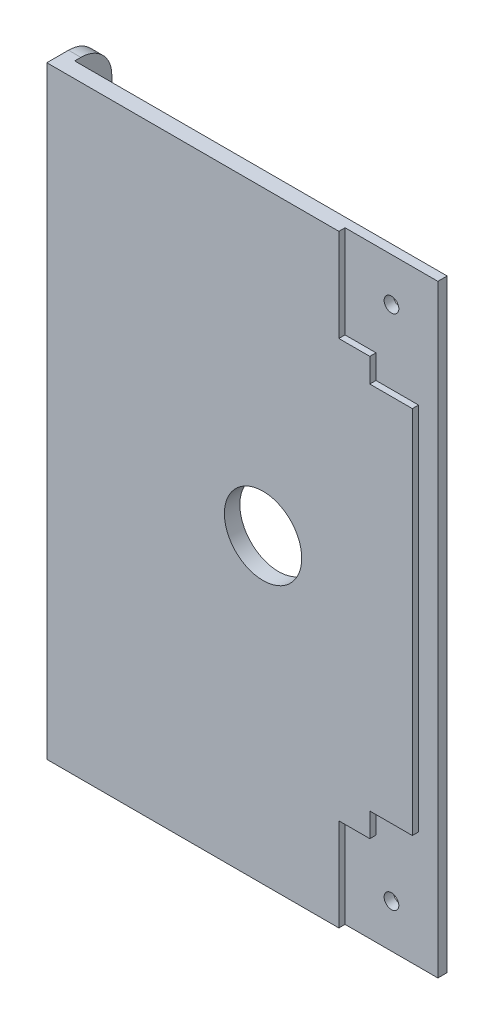
ISO-10303-21;
HEADER;
FILE_DESCRIPTION(('STEP AP214'),'2;1');
FILE_NAME('part.step','',(''),(''),'','','');
FILE_SCHEMA(('AUTOMOTIVE_DESIGN { 1 0 10303 214 1 1 1 1 }'));
ENDSEC;
DATA;
#1=APPLICATION_CONTEXT('core data for automotive mechanical design processes');
#2=APPLICATION_PROTOCOL_DEFINITION('international standard','automotive_design',2000,#1);
#3=PRODUCT_CONTEXT('',#1,'mechanical');
#4=PRODUCT('Part','Part','',(#3));
#5=PRODUCT_RELATED_PRODUCT_CATEGORY('part','',(#4));
#6=PRODUCT_DEFINITION_FORMATION('','',#4);
#7=PRODUCT_DEFINITION_CONTEXT('part definition',#1,'design');
#8=PRODUCT_DEFINITION('design','',#6,#7);
#9=PRODUCT_DEFINITION_SHAPE('','',#8);
#10=(LENGTH_UNIT() NAMED_UNIT(*) SI_UNIT(.MILLI.,.METRE.));
#11=(NAMED_UNIT(*) PLANE_ANGLE_UNIT() SI_UNIT($,.RADIAN.));
#12=(NAMED_UNIT(*) SI_UNIT($,.STERADIAN.) SOLID_ANGLE_UNIT());
#13=UNCERTAINTY_MEASURE_WITH_UNIT(LENGTH_MEASURE(1.E-05),#10,'distance_accuracy_value','');
#14=(GEOMETRIC_REPRESENTATION_CONTEXT(3) GLOBAL_UNCERTAINTY_ASSIGNED_CONTEXT((#13)) GLOBAL_UNIT_ASSIGNED_CONTEXT((#10,
#11,#12)) REPRESENTATION_CONTEXT('',''));
#15=CARTESIAN_POINT('',(0.,0.,0.));
#16=DIRECTION('',(0.,0.,1.));
#17=DIRECTION('',(1.,0.,0.));
#18=AXIS2_PLACEMENT_3D('',#15,#16,#17);
#19=CARTESIAN_POINT('',(-117.291706813187,-97.23732,5.));
#20=DIRECTION('',(0.,1.,0.));
#21=DIRECTION('',(0.,0.,1.));
#22=AXIS2_PLACEMENT_3D('',#19,#20,#21);
#23=PLANE('',#22);
#24=DIRECTION('',(1.,0.,0.));
#25=VECTOR('',#24,1.);
#26=CARTESIAN_POINT('',(-117.291706813187,-97.23732,5.));
#27=LINE('',#26,#25);
#28=CARTESIAN_POINT('',(7.08829318681305,-97.23732,5.));
#29=VERTEX_POINT('',#28);
#30=CARTESIAN_POINT('',(101.468293186813,-97.23732,5.));
#31=VERTEX_POINT('',#30);
#32=EDGE_CURVE('E235',#29,#31,#27,.T.);
#33=ORIENTED_EDGE('',*,*,#32,.F.);
#34=DIRECTION('',(0.,0.,-1.));
#35=VECTOR('',#34,1.);
#36=CARTESIAN_POINT('',(7.08829318681305,-97.23732,5.));
#37=LINE('',#36,#35);
#38=CARTESIAN_POINT('',(7.08829318681305,-97.23732,-2.));
#39=VERTEX_POINT('',#38);
#40=EDGE_CURVE('E210',#29,#39,#37,.T.);
#41=ORIENTED_EDGE('',*,*,#40,.T.);
#42=DIRECTION('',(-1.,0.,0.));
#43=VECTOR('',#42,1.);
#44=CARTESIAN_POINT('',(-117.291706813187,-97.23732,-2.));
#45=LINE('',#44,#43);
#46=CARTESIAN_POINT('',(11.088293186813,-97.23732,-2.));
#47=VERTEX_POINT('',#46);
#48=EDGE_CURVE('E308',#39,#47,#45,.F.);
#49=ORIENTED_EDGE('',*,*,#48,.T.);
#50=DIRECTION('',(0.,0.,-1.));
#51=VECTOR('',#50,1.);
#52=CARTESIAN_POINT('',(11.088293186813,-97.23732,0.));
#53=LINE('',#52,#51);
#54=CARTESIAN_POINT('',(11.088293186813,-97.23732,0.));
#55=VERTEX_POINT('',#54);
#56=EDGE_CURVE('E327',#55,#47,#53,.T.);
#57=ORIENTED_EDGE('',*,*,#56,.F.);
#58=DIRECTION('',(1.,0.,0.));
#59=VECTOR('',#58,1.);
#60=CARTESIAN_POINT('',(-117.291706813187,-97.23732,0.));
#61=LINE('',#60,#59);
#62=CARTESIAN_POINT('',(131.468293186813,-97.23732,0.));
#63=VERTEX_POINT('',#62);
#64=EDGE_CURVE('E245',#55,#63,#61,.T.);
#65=ORIENTED_EDGE('',*,*,#64,.T.);
#66=DIRECTION('',(0.,0.,-1.));
#67=VECTOR('',#66,1.);
#68=CARTESIAN_POINT('',(131.468293186813,-97.23732,5.));
#69=LINE('',#68,#67);
#70=CARTESIAN_POINT('',(131.468293186813,-97.23732,3.));
#71=VERTEX_POINT('',#70);
#72=EDGE_CURVE('E239',#71,#63,#69,.T.);
#73=ORIENTED_EDGE('',*,*,#72,.F.);
#74=DIRECTION('',(1.,0.,0.));
#75=VECTOR('',#74,1.);
#76=CARTESIAN_POINT('',(131.468293186813,-97.23732,3.));
#77=LINE('',#76,#75);
#78=CARTESIAN_POINT('',(101.468293186813,-97.23732,3.));
#79=VERTEX_POINT('',#78);
#80=EDGE_CURVE('E455',#79,#71,#77,.T.);
#81=ORIENTED_EDGE('',*,*,#80,.F.);
#82=DIRECTION('',(0.,0.,1.));
#83=VECTOR('',#82,1.);
#84=CARTESIAN_POINT('',(101.468293186813,-97.23732,3.));
#85=LINE('',#84,#83);
#86=EDGE_CURVE('E456',#79,#31,#85,.T.);
#87=ORIENTED_EDGE('',*,*,#86,.T.);
#88=EDGE_LOOP('',(#33,#41,#49,#57,#65,#73,#81,#87));
#89=FACE_BOUND('',#88,.T.);
#90=ADVANCED_FACE('F45',(#89),#23,.F.);
#91=CARTESIAN_POINT('',(131.468293186813,97.76268,5.));
#92=DIRECTION('',(-1.,0.,0.));
#93=DIRECTION('',(0.,0.,1.));
#94=AXIS2_PLACEMENT_3D('',#91,#92,#93);
#95=PLANE('',#94);
#96=DIRECTION('',(0.,1.,0.));
#97=VECTOR('',#96,1.);
#98=CARTESIAN_POINT('',(131.468293186813,97.76268,3.));
#99=LINE('',#98,#97);
#100=CARTESIAN_POINT('',(131.468293186813,97.76268,3.));
#101=VERTEX_POINT('',#100);
#102=EDGE_CURVE('E486',#71,#101,#99,.T.);
#103=ORIENTED_EDGE('',*,*,#102,.F.);
#104=ORIENTED_EDGE('',*,*,#72,.T.);
#105=DIRECTION('',(0.,1.,0.));
#106=VECTOR('',#105,1.);
#107=CARTESIAN_POINT('',(131.468293186813,97.76268,0.));
#108=LINE('',#107,#106);
#109=CARTESIAN_POINT('',(131.468293186813,97.76268,0.));
#110=VERTEX_POINT('',#109);
#111=EDGE_CURVE('E248',#63,#110,#108,.T.);
#112=ORIENTED_EDGE('',*,*,#111,.T.);
#113=DIRECTION('',(0.,0.,-1.));
#114=VECTOR('',#113,1.);
#115=CARTESIAN_POINT('',(131.468293186813,97.76268,5.));
#116=LINE('',#115,#114);
#117=EDGE_CURVE('E234',#101,#110,#116,.T.);
#118=ORIENTED_EDGE('',*,*,#117,.F.);
#119=EDGE_LOOP('',(#103,#104,#112,#118));
#120=FACE_BOUND('',#119,.T.);
#121=ADVANCED_FACE('F508',(#120),#95,.F.);
#122=CARTESIAN_POINT('',(-117.291706813187,97.76268,5.));
#123=DIRECTION('',(0.,-1.,0.));
#124=DIRECTION('',(0.,0.,-1.));
#125=AXIS2_PLACEMENT_3D('',#122,#123,#124);
#126=PLANE('',#125);
#127=DIRECTION('',(-1.,0.,0.));
#128=VECTOR('',#127,1.);
#129=CARTESIAN_POINT('',(-117.291706813187,97.76268,-2.));
#130=LINE('',#129,#128);
#131=CARTESIAN_POINT('',(11.0882931868131,97.76268,-2.));
#132=VERTEX_POINT('',#131);
#133=CARTESIAN_POINT('',(7.08829318681309,97.76268,-2.));
#134=VERTEX_POINT('',#133);
#135=EDGE_CURVE('E224',#132,#134,#130,.T.);
#136=ORIENTED_EDGE('',*,*,#135,.T.);
#137=DIRECTION('',(0.,0.,-1.));
#138=VECTOR('',#137,1.);
#139=CARTESIAN_POINT('',(7.08829318681309,97.76268,5.));
#140=LINE('',#139,#138);
#141=CARTESIAN_POINT('',(7.08829318681309,97.76268,5.));
#142=VERTEX_POINT('',#141);
#143=EDGE_CURVE('E62',#142,#134,#140,.T.);
#144=ORIENTED_EDGE('',*,*,#143,.F.);
#145=DIRECTION('',(-1.,0.,0.));
#146=VECTOR('',#145,1.);
#147=CARTESIAN_POINT('',(-117.291706813187,97.76268,5.));
#148=LINE('',#147,#146);
#149=CARTESIAN_POINT('',(101.468293186813,97.76268,5.));
#150=VERTEX_POINT('',#149);
#151=EDGE_CURVE('E221',#150,#142,#148,.T.);
#152=ORIENTED_EDGE('',*,*,#151,.F.);
#153=DIRECTION('',(0.,0.,1.));
#154=VECTOR('',#153,1.);
#155=CARTESIAN_POINT('',(101.468293186813,97.76268,3.));
#156=LINE('',#155,#154);
#157=CARTESIAN_POINT('',(101.468293186813,97.76268,3.));
#158=VERTEX_POINT('',#157);
#159=EDGE_CURVE('E476',#158,#150,#156,.T.);
#160=ORIENTED_EDGE('',*,*,#159,.F.);
#161=DIRECTION('',(-1.,0.,0.));
#162=VECTOR('',#161,1.);
#163=CARTESIAN_POINT('',(131.468293186813,97.76268,3.));
#164=LINE('',#163,#162);
#165=EDGE_CURVE('E496',#101,#158,#164,.T.);
#166=ORIENTED_EDGE('',*,*,#165,.F.);
#167=ORIENTED_EDGE('',*,*,#117,.T.);
#168=DIRECTION('',(-1.,0.,0.));
#169=VECTOR('',#168,1.);
#170=CARTESIAN_POINT('',(-117.291706813187,97.76268,0.));
#171=LINE('',#170,#169);
#172=CARTESIAN_POINT('',(11.088293186813,97.76268,0.));
#173=VERTEX_POINT('',#172);
#174=EDGE_CURVE('E241',#110,#173,#171,.T.);
#175=ORIENTED_EDGE('',*,*,#174,.T.);
#176=DIRECTION('',(0.,0.,1.));
#177=VECTOR('',#176,1.);
#178=CARTESIAN_POINT('',(11.0882931868131,97.76268,-12.));
#179=LINE('',#178,#177);
#180=EDGE_CURVE('E422',#132,#173,#179,.T.);
#181=ORIENTED_EDGE('',*,*,#180,.F.);
#182=EDGE_LOOP('',(#136,#144,#152,#160,#166,#167,#175,#181));
#183=FACE_BOUND('',#182,.T.);
#184=ADVANCED_FACE('F219',(#183),#126,.F.);
#185=CARTESIAN_POINT('',(0.,0.,5.));
#186=DIRECTION('',(0.,0.,1.));
#187=DIRECTION('',(1.,0.,0.));
#188=AXIS2_PLACEMENT_3D('',#185,#186,#187);
#189=PLANE('',#188);
#190=DIRECTION('',(0.,-1.,0.));
#191=VECTOR('',#190,1.);
#192=CARTESIAN_POINT('',(7.08829318681309,97.76268,5.));
#193=LINE('',#192,#191);
#194=EDGE_CURVE('E206',#142,#29,#193,.T.);
#195=ORIENTED_EDGE('',*,*,#194,.T.);
#196=ORIENTED_EDGE('',*,*,#32,.T.);
#197=DIRECTION('',(0.,-1.,0.));
#198=VECTOR('',#197,1.);
#199=CARTESIAN_POINT('',(101.468293186813,-97.23732,5.));
#200=LINE('',#199,#198);
#201=CARTESIAN_POINT('',(101.468293186813,-67.23732,5.));
#202=VERTEX_POINT('',#201);
#203=EDGE_CURVE('E460',#202,#31,#200,.T.);
#204=ORIENTED_EDGE('',*,*,#203,.F.);
#205=DIRECTION('',(-1.,0.,0.));
#206=VECTOR('',#205,1.);
#207=CARTESIAN_POINT('',(131.468293186813,-67.23732,5.));
#208=LINE('',#207,#206);
#209=CARTESIAN_POINT('',(111.468293186813,-67.23732,5.));
#210=VERTEX_POINT('',#209);
#211=EDGE_CURVE('E249',#210,#202,#208,.T.);
#212=ORIENTED_EDGE('',*,*,#211,.F.);
#213=DIRECTION('',(0.,-1.,0.));
#214=VECTOR('',#213,1.);
#215=CARTESIAN_POINT('',(111.468293186813,-67.23732,5.));
#216=LINE('',#215,#214);
#217=CARTESIAN_POINT('',(111.468293186813,-59.48732,5.));
#218=VERTEX_POINT('',#217);
#219=EDGE_CURVE('E359',#218,#210,#216,.T.);
#220=ORIENTED_EDGE('',*,*,#219,.F.);
#221=DIRECTION('',(-1.,0.,0.));
#222=VECTOR('',#221,1.);
#223=CARTESIAN_POINT('',(111.468293186813,-59.48732,5.));
#224=LINE('',#223,#222);
#225=CARTESIAN_POINT('',(125.218293186813,-59.48732,5.));
#226=VERTEX_POINT('',#225);
#227=EDGE_CURVE('E383',#226,#218,#224,.T.);
#228=ORIENTED_EDGE('',*,*,#227,.F.);
#229=DIRECTION('',(0.,-1.,0.));
#230=VECTOR('',#229,1.);
#231=CARTESIAN_POINT('',(125.218293186813,-59.48732,5.));
#232=LINE('',#231,#230);
#233=CARTESIAN_POINT('',(125.218293186813,60.01268,5.));
#234=VERTEX_POINT('',#233);
#235=EDGE_CURVE('E379',#234,#226,#232,.T.);
#236=ORIENTED_EDGE('',*,*,#235,.F.);
#237=DIRECTION('',(1.,0.,0.));
#238=VECTOR('',#237,1.);
#239=CARTESIAN_POINT('',(111.468293186813,60.01268,5.));
#240=LINE('',#239,#238);
#241=CARTESIAN_POINT('',(111.468293186813,60.01268,5.));
#242=VERTEX_POINT('',#241);
#243=EDGE_CURVE('E348',#242,#234,#240,.T.);
#244=ORIENTED_EDGE('',*,*,#243,.F.);
#245=DIRECTION('',(0.,-1.,0.));
#246=VECTOR('',#245,1.);
#247=CARTESIAN_POINT('',(111.468293186813,67.7626799999999,5.));
#248=LINE('',#247,#246);
#249=CARTESIAN_POINT('',(111.468293186813,67.7626799999999,5.));
#250=VERTEX_POINT('',#249);
#251=EDGE_CURVE('E342',#250,#242,#248,.T.);
#252=ORIENTED_EDGE('',*,*,#251,.F.);
#253=DIRECTION('',(1.,0.,0.));
#254=VECTOR('',#253,1.);
#255=CARTESIAN_POINT('',(131.468293186813,67.76268,5.));
#256=LINE('',#255,#254);
#257=CARTESIAN_POINT('',(101.468293186813,67.76268,5.));
#258=VERTEX_POINT('',#257);
#259=EDGE_CURVE('E482',#258,#250,#256,.T.);
#260=ORIENTED_EDGE('',*,*,#259,.F.);
#261=DIRECTION('',(0.,-1.,0.));
#262=VECTOR('',#261,1.);
#263=CARTESIAN_POINT('',(101.468293186813,97.76268,5.));
#264=LINE('',#263,#262);
#265=EDGE_CURVE('E232',#150,#258,#264,.T.);
#266=ORIENTED_EDGE('',*,*,#265,.F.);
#267=ORIENTED_EDGE('',*,*,#151,.T.);
#268=EDGE_LOOP('',(#195,#196,#204,#212,#220,#228,#236,#244,#252,#260,#266,#267));
#269=FACE_BOUND('',#268,.T.);
#270=CARTESIAN_POINT('',(76.9682931868131,0.262679999999987,5.));
#271=DIRECTION('',(0.,0.,1.));
#272=DIRECTION('',(1.,0.,0.));
#273=AXIS2_PLACEMENT_3D('',#270,#271,#272);
#274=CIRCLE('',#273,12.5);
#275=CARTESIAN_POINT('',(89.4682931868131,0.262679999999987,5.));
#276=VERTEX_POINT('',#275);
#277=EDGE_CURVE('E265',#276,#276,#274,.T.);
#278=ORIENTED_EDGE('',*,*,#277,.F.);
#279=EDGE_LOOP('',(#278));
#280=FACE_BOUND('',#279,.T.);
#281=ADVANCED_FACE('F228',(#269,#280),#189,.T.);
#282=CARTESIAN_POINT('',(0.,0.,0.));
#283=DIRECTION('',(0.,0.,1.));
#284=DIRECTION('',(1.,0.,0.));
#285=AXIS2_PLACEMENT_3D('',#282,#283,#284);
#286=PLANE('',#285);
#287=CARTESIAN_POINT('',(76.9682931868131,0.262679999999987,0.));
#288=DIRECTION('',(0.,0.,-1.));
#289=DIRECTION('',(-1.,0.,0.));
#290=AXIS2_PLACEMENT_3D('',#287,#288,#289);
#291=CIRCLE('',#290,12.5);
#292=CARTESIAN_POINT('',(64.4682931868131,0.262679999999987,0.));
#293=VERTEX_POINT('',#292);
#294=EDGE_CURVE('E432',#293,#293,#291,.T.);
#295=ORIENTED_EDGE('',*,*,#294,.F.);
#296=EDGE_LOOP('',(#295));
#297=FACE_BOUND('',#296,.T.);
#298=CARTESIAN_POINT('',(116.468293186813,83.76268,0.));
#299=DIRECTION('',(0.,0.,1.));
#300=DIRECTION('',(1.,0.,0.));
#301=AXIS2_PLACEMENT_3D('',#298,#299,#300);
#302=CIRCLE('',#301,2.375);
#303=CARTESIAN_POINT('',(118.843293186813,83.76268,0.));
#304=VERTEX_POINT('',#303);
#305=EDGE_CURVE('E264',#304,#304,#302,.T.);
#306=ORIENTED_EDGE('',*,*,#305,.T.);
#307=EDGE_LOOP('',(#306));
#308=FACE_BOUND('',#307,.T.);
#309=CARTESIAN_POINT('',(116.468293186813,-83.23732,0.));
#310=DIRECTION('',(0.,0.,1.));
#311=DIRECTION('',(1.,0.,0.));
#312=AXIS2_PLACEMENT_3D('',#309,#310,#311);
#313=CIRCLE('',#312,2.375);
#314=CARTESIAN_POINT('',(118.843293186813,-83.23732,0.));
#315=VERTEX_POINT('',#314);
#316=EDGE_CURVE('E270',#315,#315,#313,.T.);
#317=ORIENTED_EDGE('',*,*,#316,.T.);
#318=EDGE_LOOP('',(#317));
#319=FACE_BOUND('',#318,.T.);
#320=DIRECTION('',(-1.,0.,0.));
#321=VECTOR('',#320,1.);
#322=CARTESIAN_POINT('',(3.08829318681305,-57.23732,0.));
#323=LINE('',#322,#321);
#324=CARTESIAN_POINT('',(11.0882931868131,-57.23732,0.));
#325=VERTEX_POINT('',#324);
#326=CARTESIAN_POINT('',(7.08829318681305,-57.23732,0.));
#327=VERTEX_POINT('',#326);
#328=EDGE_CURVE('E273',#325,#327,#323,.T.);
#329=ORIENTED_EDGE('',*,*,#328,.T.);
#330=DIRECTION('',(0.,1.,0.));
#331=VECTOR('',#330,1.);
#332=CARTESIAN_POINT('',(7.08829318681307,0.,0.));
#333=LINE('',#332,#331);
#334=CARTESIAN_POINT('',(7.08829318681308,57.76268,0.));
#335=VERTEX_POINT('',#334);
#336=EDGE_CURVE('E537',#327,#335,#333,.T.);
#337=ORIENTED_EDGE('',*,*,#336,.T.);
#338=DIRECTION('',(-1.,0.,0.));
#339=VECTOR('',#338,1.);
#340=CARTESIAN_POINT('',(11.0882931868131,57.76268,0.));
#341=LINE('',#340,#339);
#342=CARTESIAN_POINT('',(11.0882931868131,57.76268,0.));
#343=VERTEX_POINT('',#342);
#344=EDGE_CURVE('E259',#335,#343,#341,.F.);
#345=ORIENTED_EDGE('',*,*,#344,.T.);
#346=DIRECTION('',(0.,-1.,0.));
#347=VECTOR('',#346,1.);
#348=CARTESIAN_POINT('',(11.0882931868131,97.76268,0.));
#349=LINE('',#348,#347);
#350=EDGE_CURVE('E425',#173,#343,#349,.T.);
#351=ORIENTED_EDGE('',*,*,#350,.F.);
#352=ORIENTED_EDGE('',*,*,#174,.F.);
#353=ORIENTED_EDGE('',*,*,#111,.F.);
#354=ORIENTED_EDGE('',*,*,#64,.F.);
#355=DIRECTION('',(0.,-1.,0.));
#356=VECTOR('',#355,1.);
#357=CARTESIAN_POINT('',(11.0882931868131,-67.23732,0.));
#358=LINE('',#357,#356);
#359=EDGE_CURVE('E426',#325,#55,#358,.T.);
#360=ORIENTED_EDGE('',*,*,#359,.F.);
#361=EDGE_LOOP('',(#329,#337,#345,#351,#352,#353,#354,#360));
#362=FACE_BOUND('',#361,.T.);
#363=ADVANCED_FACE('F513',(#297,#308,#319,#362),#286,.F.);
#364=CARTESIAN_POINT('',(101.468293186813,-97.23732,3.));
#365=DIRECTION('',(-1.,0.,0.));
#366=DIRECTION('',(0.,0.,1.));
#367=AXIS2_PLACEMENT_3D('',#364,#365,#366);
#368=PLANE('',#367);
#369=ORIENTED_EDGE('',*,*,#203,.T.);
#370=ORIENTED_EDGE('',*,*,#86,.F.);
#371=DIRECTION('',(0.,-1.,0.));
#372=VECTOR('',#371,1.);
#373=CARTESIAN_POINT('',(101.468293186813,-97.23732,3.));
#374=LINE('',#373,#372);
#375=CARTESIAN_POINT('',(101.468293186813,-67.23732,3.));
#376=VERTEX_POINT('',#375);
#377=EDGE_CURVE('E470',#376,#79,#374,.T.);
#378=ORIENTED_EDGE('',*,*,#377,.F.);
#379=DIRECTION('',(0.,0.,1.));
#380=VECTOR('',#379,1.);
#381=CARTESIAN_POINT('',(101.468293186813,-67.23732,3.));
#382=LINE('',#381,#380);
#383=EDGE_CURVE('E451',#376,#202,#382,.T.);
#384=ORIENTED_EDGE('',*,*,#383,.T.);
#385=EDGE_LOOP('',(#369,#370,#378,#384));
#386=FACE_BOUND('',#385,.T.);
#387=ADVANCED_FACE('F620',(#386),#368,.F.);
#388=CARTESIAN_POINT('',(131.468293186813,-67.23732,3.));
#389=DIRECTION('',(0.,1.,0.));
#390=DIRECTION('',(0.,0.,1.));
#391=AXIS2_PLACEMENT_3D('',#388,#389,#390);
#392=PLANE('',#391);
#393=DIRECTION('',(-1.,0.,0.));
#394=VECTOR('',#393,1.);
#395=CARTESIAN_POINT('',(131.468293186813,-67.23732,3.));
#396=LINE('',#395,#394);
#397=CARTESIAN_POINT('',(111.468293186813,-67.23732,3.));
#398=VERTEX_POINT('',#397);
#399=EDGE_CURVE('E464',#398,#376,#396,.T.);
#400=ORIENTED_EDGE('',*,*,#399,.F.);
#401=DIRECTION('',(0.,0.,1.));
#402=VECTOR('',#401,1.);
#403=CARTESIAN_POINT('',(111.468293186813,-67.23732,3.));
#404=LINE('',#403,#402);
#405=EDGE_CURVE('E389',#398,#210,#404,.T.);
#406=ORIENTED_EDGE('',*,*,#405,.T.);
#407=ORIENTED_EDGE('',*,*,#211,.T.);
#408=ORIENTED_EDGE('',*,*,#383,.F.);
#409=EDGE_LOOP('',(#400,#406,#407,#408));
#410=FACE_BOUND('',#409,.T.);
#411=ADVANCED_FACE('F632',(#410),#392,.F.);
#412=CARTESIAN_POINT('',(131.468293186813,67.76268,3.));
#413=DIRECTION('',(0.,-1.,0.));
#414=DIRECTION('',(0.,0.,-1.));
#415=AXIS2_PLACEMENT_3D('',#412,#413,#414);
#416=PLANE('',#415);
#417=ORIENTED_EDGE('',*,*,#259,.T.);
#418=DIRECTION('',(0.,0.,1.));
#419=VECTOR('',#418,1.);
#420=CARTESIAN_POINT('',(111.468293186813,67.7626799999999,3.));
#421=LINE('',#420,#419);
#422=CARTESIAN_POINT('',(111.468293186813,67.7626799999999,3.));
#423=VERTEX_POINT('',#422);
#424=EDGE_CURVE('E374',#423,#250,#421,.T.);
#425=ORIENTED_EDGE('',*,*,#424,.F.);
#426=DIRECTION('',(1.,0.,0.));
#427=VECTOR('',#426,1.);
#428=CARTESIAN_POINT('',(131.468293186813,67.76268,3.));
#429=LINE('',#428,#427);
#430=CARTESIAN_POINT('',(101.468293186813,67.76268,3.));
#431=VERTEX_POINT('',#430);
#432=EDGE_CURVE('E479',#431,#423,#429,.T.);
#433=ORIENTED_EDGE('',*,*,#432,.F.);
#434=DIRECTION('',(0.,0.,1.));
#435=VECTOR('',#434,1.);
#436=CARTESIAN_POINT('',(101.468293186813,67.76268,3.));
#437=LINE('',#436,#435);
#438=EDGE_CURVE('E450',#431,#258,#437,.T.);
#439=ORIENTED_EDGE('',*,*,#438,.T.);
#440=EDGE_LOOP('',(#417,#425,#433,#439));
#441=FACE_BOUND('',#440,.T.);
#442=ADVANCED_FACE('F629',(#441),#416,.F.);
#443=CARTESIAN_POINT('',(101.468293186813,97.76268,3.));
#444=DIRECTION('',(-1.,0.,0.));
#445=DIRECTION('',(0.,0.,1.));
#446=AXIS2_PLACEMENT_3D('',#443,#444,#445);
#447=PLANE('',#446);
#448=ORIENTED_EDGE('',*,*,#265,.T.);
#449=ORIENTED_EDGE('',*,*,#438,.F.);
#450=DIRECTION('',(0.,-1.,0.));
#451=VECTOR('',#450,1.);
#452=CARTESIAN_POINT('',(101.468293186813,97.76268,3.));
#453=LINE('',#452,#451);
#454=EDGE_CURVE('E492',#158,#431,#453,.T.);
#455=ORIENTED_EDGE('',*,*,#454,.F.);
#456=ORIENTED_EDGE('',*,*,#159,.T.);
#457=EDGE_LOOP('',(#448,#449,#455,#456));
#458=FACE_BOUND('',#457,.T.);
#459=ADVANCED_FACE('F627',(#458),#447,.F.);
#460=CARTESIAN_POINT('',(0.,0.,3.));
#461=DIRECTION('',(0.,0.,-1.));
#462=DIRECTION('',(-1.,0.,0.));
#463=AXIS2_PLACEMENT_3D('',#460,#461,#462);
#464=PLANE('',#463);
#465=CARTESIAN_POINT('',(116.468293186813,83.76268,3.));
#466=DIRECTION('',(0.,0.,-1.));
#467=DIRECTION('',(-1.,0.,0.));
#468=AXIS2_PLACEMENT_3D('',#465,#466,#467);
#469=CIRCLE('',#468,2.375);
#470=CARTESIAN_POINT('',(114.093293186813,83.76268,3.));
#471=VERTEX_POINT('',#470);
#472=EDGE_CURVE('E260',#471,#471,#469,.T.);
#473=ORIENTED_EDGE('',*,*,#472,.T.);
#474=EDGE_LOOP('',(#473));
#475=FACE_BOUND('',#474,.T.);
#476=ORIENTED_EDGE('',*,*,#102,.T.);
#477=ORIENTED_EDGE('',*,*,#165,.T.);
#478=ORIENTED_EDGE('',*,*,#454,.T.);
#479=ORIENTED_EDGE('',*,*,#432,.T.);
#480=DIRECTION('',(0.,-1.,0.));
#481=VECTOR('',#480,1.);
#482=CARTESIAN_POINT('',(111.468293186813,67.7626799999999,3.));
#483=LINE('',#482,#481);
#484=CARTESIAN_POINT('',(111.468293186813,60.01268,3.));
#485=VERTEX_POINT('',#484);
#486=EDGE_CURVE('E354',#423,#485,#483,.T.);
#487=ORIENTED_EDGE('',*,*,#486,.T.);
#488=DIRECTION('',(1.,0.,0.));
#489=VECTOR('',#488,1.);
#490=CARTESIAN_POINT('',(111.468293186813,60.01268,3.));
#491=LINE('',#490,#489);
#492=CARTESIAN_POINT('',(125.218293186813,60.01268,3.));
#493=VERTEX_POINT('',#492);
#494=EDGE_CURVE('E358',#485,#493,#491,.T.);
#495=ORIENTED_EDGE('',*,*,#494,.T.);
#496=DIRECTION('',(0.,-1.,0.));
#497=VECTOR('',#496,1.);
#498=CARTESIAN_POINT('',(125.218293186813,-59.48732,3.));
#499=LINE('',#498,#497);
#500=CARTESIAN_POINT('',(125.218293186813,-59.48732,3.));
#501=VERTEX_POINT('',#500);
#502=EDGE_CURVE('E363',#493,#501,#499,.T.);
#503=ORIENTED_EDGE('',*,*,#502,.T.);
#504=DIRECTION('',(-1.,0.,0.));
#505=VECTOR('',#504,1.);
#506=CARTESIAN_POINT('',(111.468293186813,-59.48732,3.));
#507=LINE('',#506,#505);
#508=CARTESIAN_POINT('',(111.468293186813,-59.48732,3.));
#509=VERTEX_POINT('',#508);
#510=EDGE_CURVE('E367',#501,#509,#507,.T.);
#511=ORIENTED_EDGE('',*,*,#510,.T.);
#512=DIRECTION('',(0.,-1.,0.));
#513=VECTOR('',#512,1.);
#514=CARTESIAN_POINT('',(111.468293186813,-67.23732,3.));
#515=LINE('',#514,#513);
#516=EDGE_CURVE('E371',#509,#398,#515,.T.);
#517=ORIENTED_EDGE('',*,*,#516,.T.);
#518=ORIENTED_EDGE('',*,*,#399,.T.);
#519=ORIENTED_EDGE('',*,*,#377,.T.);
#520=ORIENTED_EDGE('',*,*,#80,.T.);
#521=EDGE_LOOP('',(#476,#477,#478,#479,#487,#495,#503,#511,#517,#518,#519,#520));
#522=FACE_BOUND('',#521,.T.);
#523=CARTESIAN_POINT('',(116.468293186813,-83.23732,3.));
#524=DIRECTION('',(0.,0.,1.));
#525=DIRECTION('',(1.,0.,0.));
#526=AXIS2_PLACEMENT_3D('',#523,#524,#525);
#527=CIRCLE('',#526,2.375);
#528=CARTESIAN_POINT('',(118.843293186813,-83.23732,3.));
#529=VERTEX_POINT('',#528);
#530=EDGE_CURVE('E266',#529,#529,#527,.T.);
#531=ORIENTED_EDGE('',*,*,#530,.F.);
#532=EDGE_LOOP('',(#531));
#533=FACE_BOUND('',#532,.T.);
#534=ADVANCED_FACE('F502',(#475,#522,#533),#464,.F.);
#535=CARTESIAN_POINT('',(116.468293186813,83.76268,-5.));
#536=DIRECTION('',(0.,0.,1.));
#537=DIRECTION('',(1.,0.,0.));
#538=AXIS2_PLACEMENT_3D('',#535,#536,#537);
#539=CYLINDRICAL_SURFACE('',#538,2.375);
#540=ORIENTED_EDGE('',*,*,#472,.F.);
#541=EDGE_LOOP('',(#540));
#542=FACE_BOUND('',#541,.T.);
#543=ORIENTED_EDGE('',*,*,#305,.F.);
#544=EDGE_LOOP('',(#543));
#545=FACE_BOUND('',#544,.T.);
#546=ADVANCED_FACE('F626',(#542,#545),#539,.F.);
#547=CARTESIAN_POINT('',(116.468293186813,-83.23732,-5.));
#548=DIRECTION('',(0.,0.,1.));
#549=DIRECTION('',(1.,0.,0.));
#550=AXIS2_PLACEMENT_3D('',#547,#548,#549);
#551=CYLINDRICAL_SURFACE('',#550,2.375);
#552=ORIENTED_EDGE('',*,*,#530,.T.);
#553=EDGE_LOOP('',(#552));
#554=FACE_BOUND('',#553,.T.);
#555=ORIENTED_EDGE('',*,*,#316,.F.);
#556=EDGE_LOOP('',(#555));
#557=FACE_BOUND('',#556,.T.);
#558=ADVANCED_FACE('F645',(#554,#557),#551,.F.);
#559=CARTESIAN_POINT('',(76.9682931868131,0.262679999999987,10.));
#560=DIRECTION('',(0.,0.,-1.));
#561=DIRECTION('',(-1.,0.,0.));
#562=AXIS2_PLACEMENT_3D('',#559,#560,#561);
#563=CYLINDRICAL_SURFACE('',#562,12.5);
#564=ORIENTED_EDGE('',*,*,#277,.T.);
#565=EDGE_LOOP('',(#564));
#566=FACE_BOUND('',#565,.T.);
#567=ORIENTED_EDGE('',*,*,#294,.T.);
#568=EDGE_LOOP('',(#567));
#569=FACE_BOUND('',#568,.T.);
#570=ADVANCED_FACE('F649',(#566,#569),#563,.F.);
#571=CARTESIAN_POINT('',(11.088293186813,-97.23732,-12.));
#572=DIRECTION('',(0.,0.,1.));
#573=DIRECTION('',(1.,0.,0.));
#574=AXIS2_PLACEMENT_3D('',#571,#572,#573);
#575=PLANE('',#574);
#576=DIRECTION('',(-1.,0.,0.));
#577=VECTOR('',#576,1.);
#578=CARTESIAN_POINT('',(11.088293186813,-87.23732,-12.));
#579=LINE('',#578,#577);
#580=CARTESIAN_POINT('',(11.088293186813,-87.23732,-12.));
#581=VERTEX_POINT('',#580);
#582=CARTESIAN_POINT('',(7.08829318681305,-87.23732,-12.));
#583=VERTEX_POINT('',#582);
#584=EDGE_CURVE('E304',#581,#583,#579,.T.);
#585=ORIENTED_EDGE('',*,*,#584,.T.);
#586=DIRECTION('',(0.,1.,0.));
#587=VECTOR('',#586,1.);
#588=CARTESIAN_POINT('',(7.08829318681305,-97.23732,-12.));
#589=LINE('',#588,#587);
#590=CARTESIAN_POINT('',(7.08829318681305,-75.5676227798234,-12.));
#591=VERTEX_POINT('',#590);
#592=EDGE_CURVE('E343',#583,#591,#589,.T.);
#593=ORIENTED_EDGE('',*,*,#592,.T.);
#594=DIRECTION('',(1.,0.,0.));
#595=VECTOR('',#594,1.);
#596=CARTESIAN_POINT('',(11.0882931868131,-75.5676227798234,-12.));
#597=LINE('',#596,#595);
#598=CARTESIAN_POINT('',(11.0882931868131,-75.5676227798234,-12.));
#599=VERTEX_POINT('',#598);
#600=EDGE_CURVE('E298',#591,#599,#597,.T.);
#601=ORIENTED_EDGE('',*,*,#600,.T.);
#602=DIRECTION('',(0.,1.,0.));
#603=VECTOR('',#602,1.);
#604=CARTESIAN_POINT('',(11.088293186813,-97.23732,-12.));
#605=LINE('',#604,#603);
#606=EDGE_CURVE('E323',#581,#599,#605,.T.);
#607=ORIENTED_EDGE('',*,*,#606,.F.);
#608=EDGE_LOOP('',(#585,#593,#601,#607));
#609=FACE_BOUND('',#608,.T.);
#610=ADVANCED_FACE('F332',(#609),#575,.F.);
#611=CARTESIAN_POINT('',(11.0882931868131,0.,0.));
#612=DIRECTION('',(1.,0.,0.));
#613=DIRECTION('',(0.,1.,0.));
#614=AXIS2_PLACEMENT_3D('',#611,#612,#613);
#615=PLANE('',#614);
#616=CARTESIAN_POINT('',(11.0882931868131,-77.23732,-6.00000000000001));
#617=DIRECTION('',(1.,0.,0.));
#618=DIRECTION('',(0.,1.,0.));
#619=AXIS2_PLACEMENT_3D('',#616,#617,#618);
#620=CIRCLE('',#619,1.625);
#621=CARTESIAN_POINT('',(11.0882931868131,-75.61232,-6.00000000000001));
#622=VERTEX_POINT('',#621);
#623=EDGE_CURVE('E336',#622,#622,#620,.T.);
#624=ORIENTED_EDGE('',*,*,#623,.F.);
#625=EDGE_LOOP('',(#624));
#626=FACE_BOUND('',#625,.T.);
#627=CARTESIAN_POINT('',(11.0882931868131,-87.2373200000001,-6.00000000000001));
#628=DIRECTION('',(1.,0.,0.));
#629=DIRECTION('',(0.,1.,0.));
#630=AXIS2_PLACEMENT_3D('',#627,#628,#629);
#631=CIRCLE('',#630,1.625);
#632=CARTESIAN_POINT('',(11.0882931868131,-85.6123200000001,-6.00000000000001));
#633=VERTEX_POINT('',#632);
#634=EDGE_CURVE('E415',#633,#633,#631,.T.);
#635=ORIENTED_EDGE('',*,*,#634,.F.);
#636=EDGE_LOOP('',(#635));
#637=FACE_BOUND('',#636,.T.);
#638=ORIENTED_EDGE('',*,*,#56,.T.);
#639=CARTESIAN_POINT('',(11.0882931868131,-87.23732,-2.));
#640=DIRECTION('',(1.,0.,0.));
#641=DIRECTION('',(0.,1.,0.));
#642=AXIS2_PLACEMENT_3D('',#639,#640,#641);
#643=CIRCLE('',#642,10.);
#644=EDGE_CURVE('E311',#47,#581,#643,.T.);
#645=ORIENTED_EDGE('',*,*,#644,.T.);
#646=ORIENTED_EDGE('',*,*,#606,.T.);
#647=CARTESIAN_POINT('',(11.0882931868131,-75.5676227798234,-2.));
#648=DIRECTION('',(1.,0.,0.));
#649=DIRECTION('',(0.,1.,0.));
#650=AXIS2_PLACEMENT_3D('',#647,#648,#649);
#651=CIRCLE('',#650,10.);
#652=CARTESIAN_POINT('',(11.0882931868131,-66.4024713899117,-6.));
#653=VERTEX_POINT('',#652);
#654=EDGE_CURVE('E301',#599,#653,#651,.T.);
#655=ORIENTED_EDGE('',*,*,#654,.T.);
#656=CARTESIAN_POINT('',(11.0882931868131,-57.23732,-10.));
#657=DIRECTION('',(1.,0.,0.));
#658=DIRECTION('',(0.,1.,0.));
#659=AXIS2_PLACEMENT_3D('',#656,#657,#658);
#660=CIRCLE('',#659,10.);
#661=EDGE_CURVE('E277',#653,#325,#660,.F.);
#662=ORIENTED_EDGE('',*,*,#661,.T.);
#663=ORIENTED_EDGE('',*,*,#359,.T.);
#664=EDGE_LOOP('',(#638,#645,#646,#655,#662,#663));
#665=FACE_BOUND('',#664,.T.);
#666=ADVANCED_FACE('F322',(#626,#637,#665),#615,.T.);
#667=CARTESIAN_POINT('',(11.0882931868131,67.76268,-12.));
#668=DIRECTION('',(0.,0.,1.));
#669=DIRECTION('',(0.,-1.,0.));
#670=AXIS2_PLACEMENT_3D('',#667,#668,#669);
#671=PLANE('',#670);
#672=DIRECTION('',(1.,0.,0.));
#673=VECTOR('',#672,1.);
#674=CARTESIAN_POINT('',(11.0882931868131,76.0929827798233,-12.));
#675=LINE('',#674,#673);
#676=CARTESIAN_POINT('',(11.0882931868131,76.0929827798233,-12.));
#677=VERTEX_POINT('',#676);
#678=CARTESIAN_POINT('',(7.08829318681308,76.0929827798233,-12.));
#679=VERTEX_POINT('',#678);
#680=EDGE_CURVE('E284',#677,#679,#675,.F.);
#681=ORIENTED_EDGE('',*,*,#680,.T.);
#682=DIRECTION('',(0.,1.,0.));
#683=VECTOR('',#682,1.);
#684=CARTESIAN_POINT('',(7.08829318681308,67.76268,-12.));
#685=LINE('',#684,#683);
#686=CARTESIAN_POINT('',(7.08829318681309,87.76268,-12.));
#687=VERTEX_POINT('',#686);
#688=EDGE_CURVE('E519',#679,#687,#685,.T.);
#689=ORIENTED_EDGE('',*,*,#688,.T.);
#690=DIRECTION('',(-1.,0.,0.));
#691=VECTOR('',#690,1.);
#692=CARTESIAN_POINT('',(11.0882931868131,87.76268,-12.));
#693=LINE('',#692,#691);
#694=CARTESIAN_POINT('',(11.0882931868131,87.76268,-12.));
#695=VERTEX_POINT('',#694);
#696=EDGE_CURVE('E55',#687,#695,#693,.F.);
#697=ORIENTED_EDGE('',*,*,#696,.T.);
#698=DIRECTION('',(0.,1.,0.));
#699=VECTOR('',#698,1.);
#700=CARTESIAN_POINT('',(11.0882931868131,67.76268,-12.));
#701=LINE('',#700,#699);
#702=EDGE_CURVE('E430',#677,#695,#701,.T.);
#703=ORIENTED_EDGE('',*,*,#702,.F.);
#704=EDGE_LOOP('',(#681,#689,#697,#703));
#705=FACE_BOUND('',#704,.T.);
#706=ADVANCED_FACE('F588',(#705),#671,.F.);
#707=CARTESIAN_POINT('',(11.0882931868131,0.,0.));
#708=DIRECTION('',(1.,0.,0.));
#709=DIRECTION('',(0.,1.,0.));
#710=AXIS2_PLACEMENT_3D('',#707,#708,#709);
#711=PLANE('',#710);
#712=CARTESIAN_POINT('',(11.0882931868131,87.76268,-6.00000000000001));
#713=DIRECTION('',(1.,0.,0.));
#714=DIRECTION('',(0.,1.,0.));
#715=AXIS2_PLACEMENT_3D('',#712,#713,#714);
#716=CIRCLE('',#715,1.625);
#717=CARTESIAN_POINT('',(11.0882931868131,89.38768,-6.00000000000001));
#718=VERTEX_POINT('',#717);
#719=EDGE_CURVE('E411',#718,#718,#716,.T.);
#720=ORIENTED_EDGE('',*,*,#719,.F.);
#721=EDGE_LOOP('',(#720));
#722=FACE_BOUND('',#721,.T.);
#723=CARTESIAN_POINT('',(11.0882931868131,77.76268,-6.00000000000001));
#724=DIRECTION('',(1.,0.,0.));
#725=DIRECTION('',(0.,1.,0.));
#726=AXIS2_PLACEMENT_3D('',#723,#724,#725);
#727=CIRCLE('',#726,1.625);
#728=CARTESIAN_POINT('',(11.0882931868131,79.38768,-6.00000000000001));
#729=VERTEX_POINT('',#728);
#730=EDGE_CURVE('E393',#729,#729,#727,.T.);
#731=ORIENTED_EDGE('',*,*,#730,.F.);
#732=EDGE_LOOP('',(#731));
#733=FACE_BOUND('',#732,.T.);
#734=ORIENTED_EDGE('',*,*,#702,.T.);
#735=CARTESIAN_POINT('',(11.0882931868131,87.76268,-2.));
#736=DIRECTION('',(1.,0.,0.));
#737=DIRECTION('',(0.,1.,0.));
#738=AXIS2_PLACEMENT_3D('',#735,#736,#737);
#739=CIRCLE('',#738,10.);
#740=EDGE_CURVE('E11',#695,#132,#739,.T.);
#741=ORIENTED_EDGE('',*,*,#740,.T.);
#742=ORIENTED_EDGE('',*,*,#180,.T.);
#743=ORIENTED_EDGE('',*,*,#350,.T.);
#744=CARTESIAN_POINT('',(11.0882931868131,57.76268,-10.));
#745=DIRECTION('',(1.,0.,0.));
#746=DIRECTION('',(0.,1.,0.));
#747=AXIS2_PLACEMENT_3D('',#744,#745,#746);
#748=CIRCLE('',#747,10.);
#749=CARTESIAN_POINT('',(11.0882931868131,66.9278313899117,-6.));
#750=VERTEX_POINT('',#749);
#751=EDGE_CURVE('E280',#343,#750,#748,.F.);
#752=ORIENTED_EDGE('',*,*,#751,.T.);
#753=CARTESIAN_POINT('',(11.0882931868131,76.0929827798233,-2.));
#754=DIRECTION('',(1.,0.,0.));
#755=DIRECTION('',(0.,1.,0.));
#756=AXIS2_PLACEMENT_3D('',#753,#754,#755);
#757=CIRCLE('',#756,10.);
#758=EDGE_CURVE('E291',#750,#677,#757,.T.);
#759=ORIENTED_EDGE('',*,*,#758,.T.);
#760=EDGE_LOOP('',(#734,#741,#742,#743,#752,#759));
#761=FACE_BOUND('',#760,.T.);
#762=ADVANCED_FACE('F586',(#722,#733,#761),#711,.T.);
#763=CARTESIAN_POINT('',(0.,-57.23732,-10.));
#764=DIRECTION('',(1.,0.,0.));
#765=DIRECTION('',(0.,1.,0.));
#766=AXIS2_PLACEMENT_3D('',#763,#764,#765);
#767=CYLINDRICAL_SURFACE('',#766,10.);
#768=DIRECTION('',(1.,0.,0.));
#769=VECTOR('',#768,1.);
#770=CARTESIAN_POINT('',(0.,-66.4024713899117,-6.));
#771=LINE('',#770,#769);
#772=CARTESIAN_POINT('',(7.08829318681305,-66.4024713899117,-6.));
#773=VERTEX_POINT('',#772);
#774=EDGE_CURVE('E294',#653,#773,#771,.F.);
#775=ORIENTED_EDGE('',*,*,#774,.T.);
#776=CARTESIAN_POINT('',(7.08829318681305,-57.23732,-10.));
#777=DIRECTION('',(1.,0.,0.));
#778=DIRECTION('',(0.,1.,0.));
#779=AXIS2_PLACEMENT_3D('',#776,#777,#778);
#780=CIRCLE('',#779,10.);
#781=EDGE_CURVE('E541',#773,#327,#780,.F.);
#782=ORIENTED_EDGE('',*,*,#781,.T.);
#783=ORIENTED_EDGE('',*,*,#328,.F.);
#784=ORIENTED_EDGE('',*,*,#661,.F.);
#785=EDGE_LOOP('',(#775,#782,#783,#784));
#786=FACE_BOUND('',#785,.T.);
#787=ADVANCED_FACE('F553',(#786),#767,.F.);
#788=CARTESIAN_POINT('',(11.0882931868131,57.76268,-10.));
#789=DIRECTION('',(1.,0.,0.));
#790=DIRECTION('',(0.,1.,0.));
#791=AXIS2_PLACEMENT_3D('',#788,#789,#790);
#792=CYLINDRICAL_SURFACE('',#791,10.);
#793=ORIENTED_EDGE('',*,*,#344,.F.);
#794=CARTESIAN_POINT('',(7.08829318681308,57.76268,-10.));
#795=DIRECTION('',(1.,0.,0.));
#796=DIRECTION('',(0.,1.,0.));
#797=AXIS2_PLACEMENT_3D('',#794,#795,#796);
#798=CIRCLE('',#797,10.);
#799=CARTESIAN_POINT('',(7.08829318681308,66.9278313899117,-6.));
#800=VERTEX_POINT('',#799);
#801=EDGE_CURVE('E533',#335,#800,#798,.F.);
#802=ORIENTED_EDGE('',*,*,#801,.T.);
#803=DIRECTION('',(1.,0.,0.));
#804=VECTOR('',#803,1.);
#805=CARTESIAN_POINT('',(11.0882931868131,66.9278313899117,-6.));
#806=LINE('',#805,#804);
#807=EDGE_CURVE('E288',#800,#750,#806,.T.);
#808=ORIENTED_EDGE('',*,*,#807,.T.);
#809=ORIENTED_EDGE('',*,*,#751,.F.);
#810=EDGE_LOOP('',(#793,#802,#808,#809));
#811=FACE_BOUND('',#810,.T.);
#812=ADVANCED_FACE('F598',(#811),#792,.F.);
#813=CARTESIAN_POINT('',(11.0882931868131,76.0929827798233,-2.));
#814=DIRECTION('',(1.,0.,0.));
#815=DIRECTION('',(0.,1.,0.));
#816=AXIS2_PLACEMENT_3D('',#813,#814,#815);
#817=CYLINDRICAL_SURFACE('',#816,10.);
#818=CARTESIAN_POINT('',(7.08829318681308,76.0929827798233,-2.));
#819=DIRECTION('',(1.,0.,0.));
#820=DIRECTION('',(0.,1.,0.));
#821=AXIS2_PLACEMENT_3D('',#818,#819,#820);
#822=CIRCLE('',#821,10.);
#823=EDGE_CURVE('E524',#679,#800,#822,.F.);
#824=ORIENTED_EDGE('',*,*,#823,.F.);
#825=ORIENTED_EDGE('',*,*,#680,.F.);
#826=ORIENTED_EDGE('',*,*,#758,.F.);
#827=ORIENTED_EDGE('',*,*,#807,.F.);
#828=EDGE_LOOP('',(#824,#825,#826,#827));
#829=FACE_BOUND('',#828,.T.);
#830=ADVANCED_FACE('F595',(#829),#817,.T.);
#831=CARTESIAN_POINT('',(0.,-75.5676227798234,-2.));
#832=DIRECTION('',(1.,0.,0.));
#833=DIRECTION('',(0.,1.,0.));
#834=AXIS2_PLACEMENT_3D('',#831,#832,#833);
#835=CYLINDRICAL_SURFACE('',#834,10.);
#836=CARTESIAN_POINT('',(7.08829318681305,-75.5676227798234,-2.));
#837=DIRECTION('',(1.,0.,0.));
#838=DIRECTION('',(0.,1.,0.));
#839=AXIS2_PLACEMENT_3D('',#836,#837,#838);
#840=CIRCLE('',#839,10.);
#841=EDGE_CURVE('E350',#773,#591,#840,.F.);
#842=ORIENTED_EDGE('',*,*,#841,.F.);
#843=ORIENTED_EDGE('',*,*,#774,.F.);
#844=ORIENTED_EDGE('',*,*,#654,.F.);
#845=ORIENTED_EDGE('',*,*,#600,.F.);
#846=EDGE_LOOP('',(#842,#843,#844,#845));
#847=FACE_BOUND('',#846,.T.);
#848=ADVANCED_FACE('F548',(#847),#835,.T.);
#849=CARTESIAN_POINT('',(11.088293186813,-87.23732,-2.));
#850=DIRECTION('',(-1.,0.,0.));
#851=DIRECTION('',(0.,0.,1.));
#852=AXIS2_PLACEMENT_3D('',#849,#850,#851);
#853=CYLINDRICAL_SURFACE('',#852,10.);
#854=CARTESIAN_POINT('',(7.08829318681305,-87.23732,-2.));
#855=DIRECTION('',(1.,0.,0.));
#856=DIRECTION('',(0.,1.,0.));
#857=AXIS2_PLACEMENT_3D('',#854,#855,#856);
#858=CIRCLE('',#857,10.);
#859=EDGE_CURVE('E340',#583,#39,#858,.F.);
#860=ORIENTED_EDGE('',*,*,#859,.F.);
#861=ORIENTED_EDGE('',*,*,#584,.F.);
#862=ORIENTED_EDGE('',*,*,#644,.F.);
#863=ORIENTED_EDGE('',*,*,#48,.F.);
#864=EDGE_LOOP('',(#860,#861,#862,#863));
#865=FACE_BOUND('',#864,.T.);
#866=ADVANCED_FACE('F339',(#865),#853,.T.);
#867=CARTESIAN_POINT('',(-117.291706813187,87.76268,-2.));
#868=DIRECTION('',(-1.,0.,0.));
#869=DIRECTION('',(0.,0.,1.));
#870=AXIS2_PLACEMENT_3D('',#867,#868,#869);
#871=CYLINDRICAL_SURFACE('',#870,10.);
#872=CARTESIAN_POINT('',(7.08829318681309,87.76268,-2.));
#873=DIRECTION('',(1.,0.,0.));
#874=DIRECTION('',(0.,1.,0.));
#875=AXIS2_PLACEMENT_3D('',#872,#873,#874);
#876=CIRCLE('',#875,10.);
#877=EDGE_CURVE('E517',#134,#687,#876,.F.);
#878=ORIENTED_EDGE('',*,*,#877,.F.);
#879=ORIENTED_EDGE('',*,*,#135,.F.);
#880=ORIENTED_EDGE('',*,*,#740,.F.);
#881=ORIENTED_EDGE('',*,*,#696,.F.);
#882=EDGE_LOOP('',(#878,#879,#880,#881));
#883=FACE_BOUND('',#882,.T.);
#884=ADVANCED_FACE('F47',(#883),#871,.T.);
#885=CARTESIAN_POINT('',(-117.291706813187,77.76268,-6.00000000000001));
#886=DIRECTION('',(1.,0.,0.));
#887=DIRECTION('',(0.,1.,0.));
#888=AXIS2_PLACEMENT_3D('',#885,#886,#887);
#889=CYLINDRICAL_SURFACE('',#888,1.625);
#890=CARTESIAN_POINT('',(7.08829318681309,77.76268,-6.00000000000001));
#891=DIRECTION('',(1.,0.,0.));
#892=DIRECTION('',(0.,1.,0.));
#893=AXIS2_PLACEMENT_3D('',#890,#891,#892);
#894=CIRCLE('',#893,1.625);
#895=CARTESIAN_POINT('',(7.08829318681309,79.38768,-6.00000000000001));
#896=VERTEX_POINT('',#895);
#897=EDGE_CURVE('E520',#896,#896,#894,.F.);
#898=ORIENTED_EDGE('',*,*,#897,.T.);
#899=EDGE_LOOP('',(#898));
#900=FACE_BOUND('',#899,.T.);
#901=ORIENTED_EDGE('',*,*,#730,.T.);
#902=EDGE_LOOP('',(#901));
#903=FACE_BOUND('',#902,.T.);
#904=ADVANCED_FACE('F580',(#900,#903),#889,.F.);
#905=CARTESIAN_POINT('',(-117.291706813187,87.76268,-6.00000000000001));
#906=DIRECTION('',(1.,0.,0.));
#907=DIRECTION('',(0.,1.,0.));
#908=AXIS2_PLACEMENT_3D('',#905,#906,#907);
#909=CYLINDRICAL_SURFACE('',#908,1.625);
#910=CARTESIAN_POINT('',(7.08829318681309,87.76268,-6.00000000000001));
#911=DIRECTION('',(1.,0.,0.));
#912=DIRECTION('',(0.,1.,0.));
#913=AXIS2_PLACEMENT_3D('',#910,#911,#912);
#914=CIRCLE('',#913,1.625);
#915=CARTESIAN_POINT('',(7.08829318681309,89.38768,-6.00000000000001));
#916=VERTEX_POINT('',#915);
#917=EDGE_CURVE('E527',#916,#916,#914,.F.);
#918=ORIENTED_EDGE('',*,*,#917,.T.);
#919=EDGE_LOOP('',(#918));
#920=FACE_BOUND('',#919,.T.);
#921=ORIENTED_EDGE('',*,*,#719,.T.);
#922=EDGE_LOOP('',(#921));
#923=FACE_BOUND('',#922,.T.);
#924=ADVANCED_FACE('F568',(#920,#923),#909,.F.);
#925=CARTESIAN_POINT('',(-117.291706813187,-87.23732,-6.00000000000001));
#926=DIRECTION('',(1.,0.,0.));
#927=DIRECTION('',(0.,1.,0.));
#928=AXIS2_PLACEMENT_3D('',#925,#926,#927);
#929=CYLINDRICAL_SURFACE('',#928,1.625);
#930=CARTESIAN_POINT('',(7.08829318681305,-87.2373200000001,-6.00000000000001));
#931=DIRECTION('',(1.,0.,0.));
#932=DIRECTION('',(0.,1.,0.));
#933=AXIS2_PLACEMENT_3D('',#930,#931,#932);
#934=CIRCLE('',#933,1.625);
#935=CARTESIAN_POINT('',(7.08829318681305,-85.6123200000001,-6.00000000000001));
#936=VERTEX_POINT('',#935);
#937=EDGE_CURVE('E560',#936,#936,#934,.F.);
#938=ORIENTED_EDGE('',*,*,#937,.T.);
#939=EDGE_LOOP('',(#938));
#940=FACE_BOUND('',#939,.T.);
#941=ORIENTED_EDGE('',*,*,#634,.T.);
#942=EDGE_LOOP('',(#941));
#943=FACE_BOUND('',#942,.T.);
#944=ADVANCED_FACE('F661',(#940,#943),#929,.F.);
#945=CARTESIAN_POINT('',(-117.291706813187,-77.23732,-6.00000000000001));
#946=DIRECTION('',(1.,0.,0.));
#947=DIRECTION('',(0.,1.,0.));
#948=AXIS2_PLACEMENT_3D('',#945,#946,#947);
#949=CYLINDRICAL_SURFACE('',#948,1.625);
#950=CARTESIAN_POINT('',(7.08829318681305,-77.23732,-6.00000000000001));
#951=DIRECTION('',(1.,0.,0.));
#952=DIRECTION('',(0.,1.,0.));
#953=AXIS2_PLACEMENT_3D('',#950,#951,#952);
#954=CIRCLE('',#953,1.625);
#955=CARTESIAN_POINT('',(7.08829318681305,-75.61232,-6.00000000000001));
#956=VERTEX_POINT('',#955);
#957=EDGE_CURVE('E49',#956,#956,#954,.F.);
#958=ORIENTED_EDGE('',*,*,#957,.T.);
#959=EDGE_LOOP('',(#958));
#960=FACE_BOUND('',#959,.T.);
#961=ORIENTED_EDGE('',*,*,#623,.T.);
#962=EDGE_LOOP('',(#961));
#963=FACE_BOUND('',#962,.T.);
#964=ADVANCED_FACE('F663',(#960,#963),#949,.F.);
#965=CARTESIAN_POINT('',(111.468293186813,-67.23732,3.));
#966=DIRECTION('',(-1.,0.,0.));
#967=DIRECTION('',(0.,0.,1.));
#968=AXIS2_PLACEMENT_3D('',#965,#966,#967);
#969=PLANE('',#968);
#970=ORIENTED_EDGE('',*,*,#219,.T.);
#971=ORIENTED_EDGE('',*,*,#405,.F.);
#972=ORIENTED_EDGE('',*,*,#516,.F.);
#973=DIRECTION('',(0.,0.,1.));
#974=VECTOR('',#973,1.);
#975=CARTESIAN_POINT('',(111.468293186813,-59.48732,3.));
#976=LINE('',#975,#974);
#977=EDGE_CURVE('E394',#509,#218,#976,.T.);
#978=ORIENTED_EDGE('',*,*,#977,.T.);
#979=EDGE_LOOP('',(#970,#971,#972,#978));
#980=FACE_BOUND('',#979,.T.);
#981=ADVANCED_FACE('F668',(#980),#969,.F.);
#982=CARTESIAN_POINT('',(111.468293186813,-59.48732,3.));
#983=DIRECTION('',(0.,1.,0.));
#984=DIRECTION('',(0.,0.,1.));
#985=AXIS2_PLACEMENT_3D('',#982,#983,#984);
#986=PLANE('',#985);
#987=ORIENTED_EDGE('',*,*,#227,.T.);
#988=ORIENTED_EDGE('',*,*,#977,.F.);
#989=ORIENTED_EDGE('',*,*,#510,.F.);
#990=DIRECTION('',(0.,0.,1.));
#991=VECTOR('',#990,1.);
#992=CARTESIAN_POINT('',(125.218293186813,-59.48732,3.));
#993=LINE('',#992,#991);
#994=EDGE_CURVE('E397',#501,#226,#993,.T.);
#995=ORIENTED_EDGE('',*,*,#994,.T.);
#996=EDGE_LOOP('',(#987,#988,#989,#995));
#997=FACE_BOUND('',#996,.T.);
#998=ADVANCED_FACE('F681',(#997),#986,.F.);
#999=CARTESIAN_POINT('',(125.218293186813,-59.48732,3.));
#1000=DIRECTION('',(-1.,0.,0.));
#1001=DIRECTION('',(0.,-1.,0.));
#1002=AXIS2_PLACEMENT_3D('',#999,#1000,#1001);
#1003=PLANE('',#1002);
#1004=ORIENTED_EDGE('',*,*,#235,.T.);
#1005=ORIENTED_EDGE('',*,*,#994,.F.);
#1006=ORIENTED_EDGE('',*,*,#502,.F.);
#1007=DIRECTION('',(0.,0.,1.));
#1008=VECTOR('',#1007,1.);
#1009=CARTESIAN_POINT('',(125.218293186813,60.01268,3.));
#1010=LINE('',#1009,#1008);
#1011=EDGE_CURVE('E400',#493,#234,#1010,.T.);
#1012=ORIENTED_EDGE('',*,*,#1011,.T.);
#1013=EDGE_LOOP('',(#1004,#1005,#1006,#1012));
#1014=FACE_BOUND('',#1013,.T.);
#1015=ADVANCED_FACE('F677',(#1014),#1003,.F.);
#1016=CARTESIAN_POINT('',(111.468293186813,60.01268,3.));
#1017=DIRECTION('',(0.,-1.,0.));
#1018=DIRECTION('',(1.,0.,0.));
#1019=AXIS2_PLACEMENT_3D('',#1016,#1017,#1018);
#1020=PLANE('',#1019);
#1021=ORIENTED_EDGE('',*,*,#243,.T.);
#1022=ORIENTED_EDGE('',*,*,#1011,.F.);
#1023=ORIENTED_EDGE('',*,*,#494,.F.);
#1024=DIRECTION('',(0.,0.,1.));
#1025=VECTOR('',#1024,1.);
#1026=CARTESIAN_POINT('',(111.468293186813,60.01268,3.));
#1027=LINE('',#1026,#1025);
#1028=EDGE_CURVE('E403',#485,#242,#1027,.T.);
#1029=ORIENTED_EDGE('',*,*,#1028,.T.);
#1030=EDGE_LOOP('',(#1021,#1022,#1023,#1029));
#1031=FACE_BOUND('',#1030,.T.);
#1032=ADVANCED_FACE('F673',(#1031),#1020,.F.);
#1033=CARTESIAN_POINT('',(111.468293186813,67.7626799999999,3.));
#1034=DIRECTION('',(-1.,0.,0.));
#1035=DIRECTION('',(0.,-1.,0.));
#1036=AXIS2_PLACEMENT_3D('',#1033,#1034,#1035);
#1037=PLANE('',#1036);
#1038=ORIENTED_EDGE('',*,*,#251,.T.);
#1039=ORIENTED_EDGE('',*,*,#1028,.F.);
#1040=ORIENTED_EDGE('',*,*,#486,.F.);
#1041=ORIENTED_EDGE('',*,*,#424,.T.);
#1042=EDGE_LOOP('',(#1038,#1039,#1040,#1041));
#1043=FACE_BOUND('',#1042,.T.);
#1044=ADVANCED_FACE('F572',(#1043),#1037,.F.);
#1045=CARTESIAN_POINT('',(7.08829318681309,97.76268,5.));
#1046=DIRECTION('',(1.,0.,0.));
#1047=DIRECTION('',(0.,1.,0.));
#1048=AXIS2_PLACEMENT_3D('',#1045,#1046,#1047);
#1049=PLANE('',#1048);
#1050=ORIENTED_EDGE('',*,*,#859,.T.);
#1051=ORIENTED_EDGE('',*,*,#40,.F.);
#1052=ORIENTED_EDGE('',*,*,#194,.F.);
#1053=ORIENTED_EDGE('',*,*,#143,.T.);
#1054=ORIENTED_EDGE('',*,*,#877,.T.);
#1055=ORIENTED_EDGE('',*,*,#688,.F.);
#1056=ORIENTED_EDGE('',*,*,#823,.T.);
#1057=ORIENTED_EDGE('',*,*,#801,.F.);
#1058=ORIENTED_EDGE('',*,*,#336,.F.);
#1059=ORIENTED_EDGE('',*,*,#781,.F.);
#1060=ORIENTED_EDGE('',*,*,#841,.T.);
#1061=ORIENTED_EDGE('',*,*,#592,.F.);
#1062=EDGE_LOOP('',(#1050,#1051,#1052,#1053,#1054,#1055,#1056,#1057,#1058,#1059,#1060,#1061));
#1063=FACE_BOUND('',#1062,.T.);
#1064=ORIENTED_EDGE('',*,*,#917,.F.);
#1065=EDGE_LOOP('',(#1064));
#1066=FACE_BOUND('',#1065,.T.);
#1067=ORIENTED_EDGE('',*,*,#957,.F.);
#1068=EDGE_LOOP('',(#1067));
#1069=FACE_BOUND('',#1068,.T.);
#1070=ORIENTED_EDGE('',*,*,#937,.F.);
#1071=EDGE_LOOP('',(#1070));
#1072=FACE_BOUND('',#1071,.T.);
#1073=ORIENTED_EDGE('',*,*,#897,.F.);
#1074=EDGE_LOOP('',(#1073));
#1075=FACE_BOUND('',#1074,.T.);
#1076=ADVANCED_FACE('F207',(#1063,#1066,#1069,#1072,#1075),#1049,.F.);
#1077=CLOSED_SHELL('',(#90,#121,#184,#281,#363,#387,#411,#442,#459,#534,#546,#558,#570,#610,
#666,#706,#762,#787,#812,#830,#848,#866,#884,#904,#924,#944,#964,#981,#998,#1015,#1032,#1044,#1076));
#1078=MANIFOLD_SOLID_BREP('B2',#1077);
#1079=ADVANCED_BREP_SHAPE_REPRESENTATION('',(#18,#1078),#14);
#1080=SHAPE_DEFINITION_REPRESENTATION(#9,#1079);
ENDSEC;
END-ISO-10303-21;
